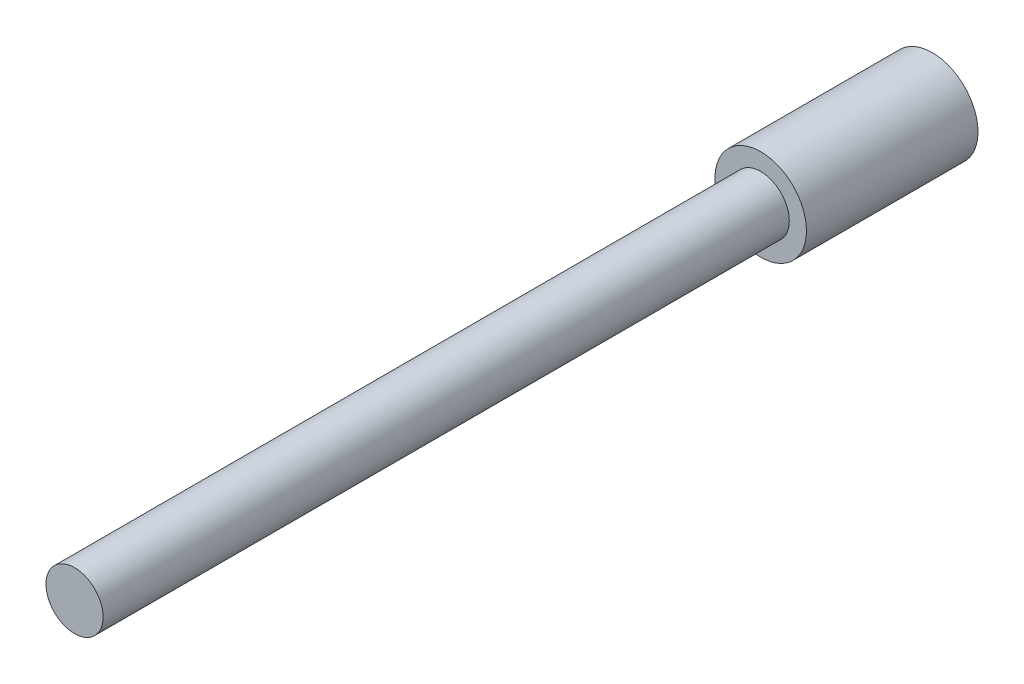
ISO-10303-21;
HEADER;
FILE_DESCRIPTION(('STEP AP214'),'2;1');
FILE_NAME('part.step','',(''),(''),'','','');
FILE_SCHEMA(('AUTOMOTIVE_DESIGN { 1 0 10303 214 1 1 1 1 }'));
ENDSEC;
DATA;
#1=APPLICATION_CONTEXT('core data for automotive mechanical design processes');
#2=APPLICATION_PROTOCOL_DEFINITION('international standard','automotive_design',2000,#1);
#3=PRODUCT_CONTEXT('',#1,'mechanical');
#4=PRODUCT('Part','Part','',(#3));
#5=PRODUCT_RELATED_PRODUCT_CATEGORY('part','',(#4));
#6=PRODUCT_DEFINITION_FORMATION('','',#4);
#7=PRODUCT_DEFINITION_CONTEXT('part definition',#1,'design');
#8=PRODUCT_DEFINITION('design','',#6,#7);
#9=PRODUCT_DEFINITION_SHAPE('','',#8);
#10=(LENGTH_UNIT() NAMED_UNIT(*) SI_UNIT(.MILLI.,.METRE.));
#11=(NAMED_UNIT(*) PLANE_ANGLE_UNIT() SI_UNIT($,.RADIAN.));
#12=(NAMED_UNIT(*) SI_UNIT($,.STERADIAN.) SOLID_ANGLE_UNIT());
#13=UNCERTAINTY_MEASURE_WITH_UNIT(LENGTH_MEASURE(1.E-05),#10,'distance_accuracy_value','');
#14=(GEOMETRIC_REPRESENTATION_CONTEXT(3) GLOBAL_UNCERTAINTY_ASSIGNED_CONTEXT((#13)) GLOBAL_UNIT_ASSIGNED_CONTEXT((#10,
#11,#12)) REPRESENTATION_CONTEXT('',''));
#15=CARTESIAN_POINT('',(0.,0.,0.));
#16=DIRECTION('',(0.,0.,1.));
#17=DIRECTION('',(1.,0.,0.));
#18=AXIS2_PLACEMENT_3D('',#15,#16,#17);
#19=CARTESIAN_POINT('',(0.,0.,15.));
#20=DIRECTION('',(0.,0.,-1.));
#21=DIRECTION('',(-1.,0.,0.));
#22=AXIS2_PLACEMENT_3D('',#19,#20,#21);
#23=CYLINDRICAL_SURFACE('',#22,1.5);
#24=CARTESIAN_POINT('',(0.,0.,0.));
#25=DIRECTION('',(0.,0.,1.));
#26=DIRECTION('',(1.,0.,0.));
#27=AXIS2_PLACEMENT_3D('',#24,#25,#26);
#28=CIRCLE('',#27,1.5);
#29=CARTESIAN_POINT('',(1.5,0.,0.));
#30=VERTEX_POINT('',#29);
#31=EDGE_CURVE('E49',#30,#30,#28,.T.);
#32=ORIENTED_EDGE('',*,*,#31,.F.);
#33=EDGE_LOOP('',(#32));
#34=FACE_BOUND('',#33,.T.);
#35=CARTESIAN_POINT('',(0.,0.,10.));
#36=DIRECTION('',(0.,0.,1.));
#37=DIRECTION('',(1.,0.,0.));
#38=AXIS2_PLACEMENT_3D('',#35,#36,#37);
#39=CIRCLE('',#38,1.5);
#40=CARTESIAN_POINT('',(1.5,0.,10.));
#41=VERTEX_POINT('',#40);
#42=EDGE_CURVE('E46',#41,#41,#39,.T.);
#43=ORIENTED_EDGE('',*,*,#42,.T.);
#44=EDGE_LOOP('',(#43));
#45=FACE_BOUND('',#44,.T.);
#46=ADVANCED_FACE('F30',(#34,#45),#23,.F.);
#47=CARTESIAN_POINT('',(0.,0.,15.));
#48=DIRECTION('',(0.,0.,1.));
#49=DIRECTION('',(1.,0.,0.));
#50=AXIS2_PLACEMENT_3D('',#47,#48,#49);
#51=PLANE('',#50);
#52=CARTESIAN_POINT('',(0.,0.,15.));
#53=DIRECTION('',(0.,0.,1.));
#54=DIRECTION('',(1.,0.,0.));
#55=AXIS2_PLACEMENT_3D('',#52,#53,#54);
#56=CIRCLE('',#55,2.5);
#57=CARTESIAN_POINT('',(2.5,0.,15.));
#58=VERTEX_POINT('',#57);
#59=EDGE_CURVE('E10',#58,#58,#56,.T.);
#60=ORIENTED_EDGE('',*,*,#59,.F.);
#61=EDGE_LOOP('',(#60));
#62=FACE_BOUND('',#61,.T.);
#63=CARTESIAN_POINT('',(0.,0.,15.));
#64=DIRECTION('',(0.,0.,1.));
#65=DIRECTION('',(1.,0.,0.));
#66=AXIS2_PLACEMENT_3D('',#63,#64,#65);
#67=CIRCLE('',#66,4.);
#68=CARTESIAN_POINT('',(4.,0.,15.));
#69=VERTEX_POINT('',#68);
#70=EDGE_CURVE('E38',#69,#69,#67,.T.);
#71=ORIENTED_EDGE('',*,*,#70,.T.);
#72=EDGE_LOOP('',(#71));
#73=FACE_BOUND('',#72,.T.);
#74=ADVANCED_FACE('F59',(#62,#73),#51,.T.);
#75=CARTESIAN_POINT('',(0.,0.,0.));
#76=DIRECTION('',(0.,0.,1.));
#77=DIRECTION('',(1.,0.,0.));
#78=AXIS2_PLACEMENT_3D('',#75,#76,#77);
#79=PLANE('',#78);
#80=CARTESIAN_POINT('',(0.,0.,0.));
#81=DIRECTION('',(0.,0.,1.));
#82=DIRECTION('',(1.,0.,0.));
#83=AXIS2_PLACEMENT_3D('',#80,#81,#82);
#84=CIRCLE('',#83,4.);
#85=CARTESIAN_POINT('',(4.,0.,0.));
#86=VERTEX_POINT('',#85);
#87=EDGE_CURVE('E34',#86,#86,#84,.T.);
#88=ORIENTED_EDGE('',*,*,#87,.F.);
#89=EDGE_LOOP('',(#88));
#90=FACE_BOUND('',#89,.T.);
#91=ORIENTED_EDGE('',*,*,#31,.T.);
#92=EDGE_LOOP('',(#91));
#93=FACE_BOUND('',#92,.T.);
#94=ADVANCED_FACE('F57',(#90,#93),#79,.F.);
#95=CARTESIAN_POINT('',(0.,0.,15.));
#96=DIRECTION('',(0.,0.,-1.));
#97=DIRECTION('',(-1.,0.,0.));
#98=AXIS2_PLACEMENT_3D('',#95,#96,#97);
#99=CYLINDRICAL_SURFACE('',#98,4.);
#100=ORIENTED_EDGE('',*,*,#70,.F.);
#101=EDGE_LOOP('',(#100));
#102=FACE_BOUND('',#101,.T.);
#103=ORIENTED_EDGE('',*,*,#87,.T.);
#104=EDGE_LOOP('',(#103));
#105=FACE_BOUND('',#104,.T.);
#106=ADVANCED_FACE('F32',(#102,#105),#99,.T.);
#107=CARTESIAN_POINT('',(0.,0.,10.));
#108=DIRECTION('',(0.,0.,1.));
#109=DIRECTION('',(1.,0.,0.));
#110=AXIS2_PLACEMENT_3D('',#107,#108,#109);
#111=PLANE('',#110);
#112=ORIENTED_EDGE('',*,*,#42,.F.);
#113=EDGE_LOOP('',(#112));
#114=FACE_BOUND('',#113,.T.);
#115=ADVANCED_FACE('F64',(#114),#111,.F.);
#116=CARTESIAN_POINT('',(0.,0.,75.));
#117=DIRECTION('',(0.,0.,-1.));
#118=DIRECTION('',(-1.,0.,0.));
#119=AXIS2_PLACEMENT_3D('',#116,#117,#118);
#120=CYLINDRICAL_SURFACE('',#119,2.5);
#121=CARTESIAN_POINT('',(0.,0.,75.));
#122=DIRECTION('',(0.,0.,1.));
#123=DIRECTION('',(1.,0.,0.));
#124=AXIS2_PLACEMENT_3D('',#121,#122,#123);
#125=CIRCLE('',#124,2.5);
#126=CARTESIAN_POINT('',(2.5,0.,75.));
#127=VERTEX_POINT('',#126);
#128=EDGE_CURVE('E45',#127,#127,#125,.T.);
#129=ORIENTED_EDGE('',*,*,#128,.F.);
#130=EDGE_LOOP('',(#129));
#131=FACE_BOUND('',#130,.T.);
#132=ORIENTED_EDGE('',*,*,#59,.T.);
#133=EDGE_LOOP('',(#132));
#134=FACE_BOUND('',#133,.T.);
#135=ADVANCED_FACE('F77',(#131,#134),#120,.T.);
#136=CARTESIAN_POINT('',(0.,0.,75.));
#137=DIRECTION('',(0.,0.,1.));
#138=DIRECTION('',(1.,0.,0.));
#139=AXIS2_PLACEMENT_3D('',#136,#137,#138);
#140=PLANE('',#139);
#141=ORIENTED_EDGE('',*,*,#128,.T.);
#142=EDGE_LOOP('',(#141));
#143=FACE_BOUND('',#142,.T.);
#144=ADVANCED_FACE('F81',(#143),#140,.T.);
#145=CLOSED_SHELL('',(#46,#74,#94,#106,#115,#135,#144));
#146=MANIFOLD_SOLID_BREP('B2',#145);
#147=ADVANCED_BREP_SHAPE_REPRESENTATION('',(#18,#146),#14);
#148=SHAPE_DEFINITION_REPRESENTATION(#9,#147);
ENDSEC;
END-ISO-10303-21;
